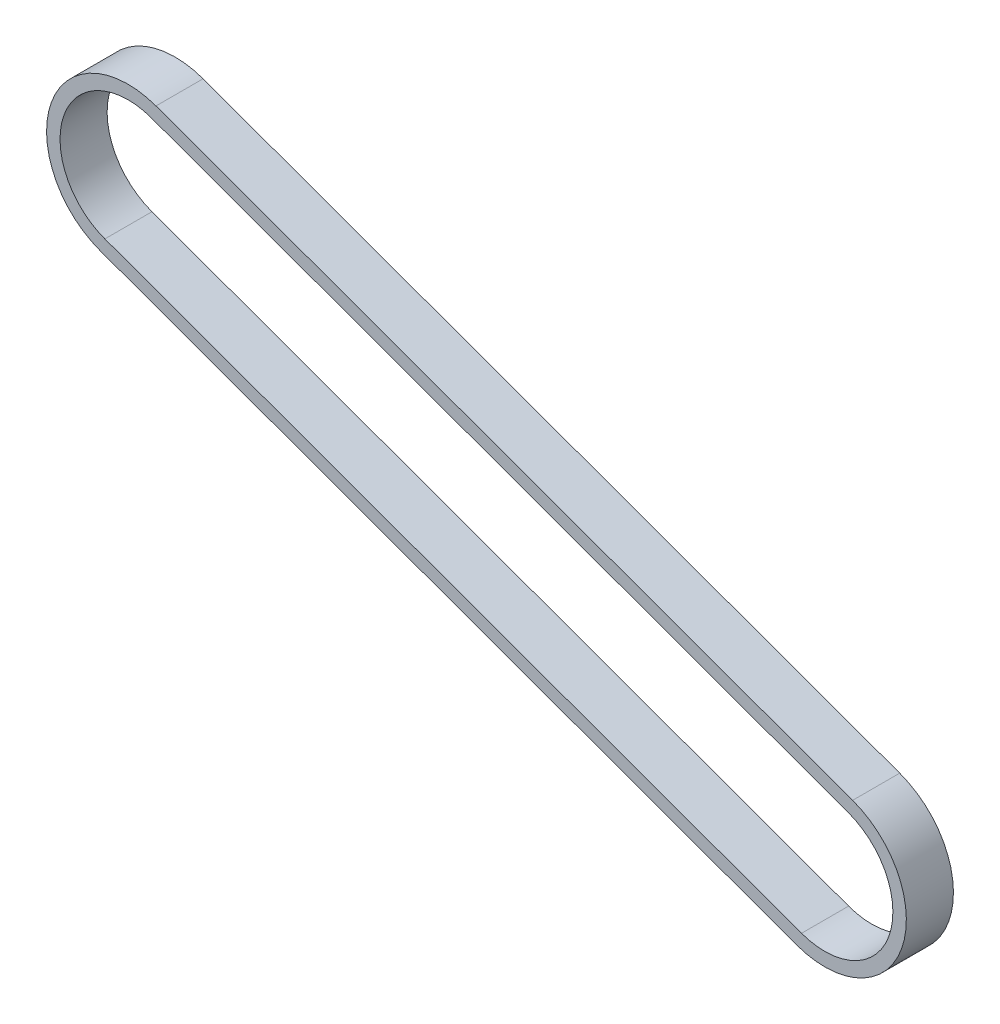
ISO-10303-21;
HEADER;
FILE_DESCRIPTION(('STEP AP214'),'2;1');
FILE_NAME('part.step','',(''),(''),'','','');
FILE_SCHEMA(('AUTOMOTIVE_DESIGN { 1 0 10303 214 1 1 1 1 }'));
ENDSEC;
DATA;
#1=APPLICATION_CONTEXT('core data for automotive mechanical design processes');
#2=APPLICATION_PROTOCOL_DEFINITION('international standard','automotive_design',2000,#1);
#3=PRODUCT_CONTEXT('',#1,'mechanical');
#4=PRODUCT('Part','Part','',(#3));
#5=PRODUCT_RELATED_PRODUCT_CATEGORY('part','',(#4));
#6=PRODUCT_DEFINITION_FORMATION('','',#4);
#7=PRODUCT_DEFINITION_CONTEXT('part definition',#1,'design');
#8=PRODUCT_DEFINITION('design','',#6,#7);
#9=PRODUCT_DEFINITION_SHAPE('','',#8);
#10=(LENGTH_UNIT() NAMED_UNIT(*) SI_UNIT(.MILLI.,.METRE.));
#11=(NAMED_UNIT(*) PLANE_ANGLE_UNIT() SI_UNIT($,.RADIAN.));
#12=(NAMED_UNIT(*) SI_UNIT($,.STERADIAN.) SOLID_ANGLE_UNIT());
#13=UNCERTAINTY_MEASURE_WITH_UNIT(LENGTH_MEASURE(1.E-05),#10,'distance_accuracy_value','');
#14=(GEOMETRIC_REPRESENTATION_CONTEXT(3) GLOBAL_UNCERTAINTY_ASSIGNED_CONTEXT((#13)) GLOBAL_UNIT_ASSIGNED_CONTEXT((#10,
#11,#12)) REPRESENTATION_CONTEXT('',''));
#15=CARTESIAN_POINT('',(0.,0.,0.));
#16=DIRECTION('',(0.,0.,1.));
#17=DIRECTION('',(1.,0.,0.));
#18=AXIS2_PLACEMENT_3D('',#15,#16,#17);
#19=CARTESIAN_POINT('',(-10.2557737110767,3.19883008970123E-12,3.5));
#20=DIRECTION('',(0.,0.,-1.));
#21=DIRECTION('',(-1.,0.,0.));
#22=AXIS2_PLACEMENT_3D('',#19,#20,#21);
#23=PLANE('',#22);
#24=CARTESIAN_POINT('',(-10.2557737110767,3.19883008970123E-12,3.5));
#25=DIRECTION('',(0.,0.,-1.));
#26=DIRECTION('',(-1.,0.,0.));
#27=AXIS2_PLACEMENT_3D('',#24,#25,#26);
#28=CIRCLE('',#27,12.125);
#29=CARTESIAN_POINT('',(-6.11685501181612,11.3967090425694,3.5));
#30=VERTEX_POINT('',#29);
#31=CARTESIAN_POINT('',(-14.3946924103373,-11.396709042563,3.5));
#32=VERTEX_POINT('',#31);
#33=EDGE_CURVE('E160',#30,#32,#28,.F.);
#34=ORIENTED_EDGE('',*,*,#33,.T.);
#35=DIRECTION('',(0.939934766397216,-0.341354119526645,0.));
#36=VECTOR('',#35,1.);
#37=CARTESIAN_POINT('',(-14.3946924103373,-11.396709042563,3.5));
#38=LINE('',#37,#36);
#39=CARTESIAN_POINT('',(89.17841263629,-49.0111343662999,3.5));
#40=VERTEX_POINT('',#39);
#41=EDGE_CURVE('E163',#32,#40,#38,.T.);
#42=ORIENTED_EDGE('',*,*,#41,.T.);
#43=CARTESIAN_POINT('',(93.3173313355506,-37.6144253237337,3.5));
#44=DIRECTION('',(0.,0.,-1.));
#45=DIRECTION('',(-1.,0.,0.));
#46=AXIS2_PLACEMENT_3D('',#43,#44,#45);
#47=CIRCLE('',#46,12.125);
#48=CARTESIAN_POINT('',(97.4562500348111,-26.2177162811674,3.5));
#49=VERTEX_POINT('',#48);
#50=EDGE_CURVE('E166',#40,#49,#47,.F.);
#51=ORIENTED_EDGE('',*,*,#50,.T.);
#52=DIRECTION('',(-0.939934766397216,0.341354119526645,0.));
#53=VECTOR('',#52,1.);
#54=CARTESIAN_POINT('',(-6.11685501181612,11.3967090425694,3.5));
#55=LINE('',#54,#53);
#56=EDGE_CURVE('E168',#49,#30,#55,.T.);
#57=ORIENTED_EDGE('',*,*,#56,.T.);
#58=EDGE_LOOP('',(#34,#42,#51,#57));
#59=FACE_BOUND('',#58,.T.);
#60=CARTESIAN_POINT('',(-10.2557737110767,3.19883008970123E-12,3.5));
#61=DIRECTION('',(0.,0.,1.));
#62=DIRECTION('',(-1.,0.,0.));
#63=AXIS2_PLACEMENT_3D('',#60,#61,#62);
#64=CIRCLE('',#63,10.125);
#65=CARTESIAN_POINT('',(-6.79956325086941,9.51683950977501,3.5));
#66=VERTEX_POINT('',#65);
#67=CARTESIAN_POINT('',(-13.711984171284,-9.51683950976862,3.5));
#68=VERTEX_POINT('',#67);
#69=EDGE_CURVE('E124',#66,#68,#64,.T.);
#70=ORIENTED_EDGE('',*,*,#69,.F.);
#71=DIRECTION('',(-0.939934766397216,0.341354119526645,0.));
#72=VECTOR('',#71,1.);
#73=CARTESIAN_POINT('',(-6.79956325086941,9.51683950977501,3.5));
#74=LINE('',#73,#72);
#75=CARTESIAN_POINT('',(96.7735417957578,-28.0975858139619,3.5));
#76=VERTEX_POINT('',#75);
#77=EDGE_CURVE('E146',#76,#66,#74,.T.);
#78=ORIENTED_EDGE('',*,*,#77,.F.);
#79=CARTESIAN_POINT('',(93.3173313355506,-37.6144253237337,3.5));
#80=DIRECTION('',(0.,0.,1.));
#81=DIRECTION('',(-1.,0.,0.));
#82=AXIS2_PLACEMENT_3D('',#79,#80,#81);
#83=CIRCLE('',#82,10.125);
#84=CARTESIAN_POINT('',(89.8611208753433,-47.1312648335055,3.5));
#85=VERTEX_POINT('',#84);
#86=EDGE_CURVE('E144',#85,#76,#83,.T.);
#87=ORIENTED_EDGE('',*,*,#86,.F.);
#88=DIRECTION('',(0.939934766397216,-0.341354119526645,0.));
#89=VECTOR('',#88,1.);
#90=CARTESIAN_POINT('',(89.8611208753433,-47.1312648335055,3.5));
#91=LINE('',#90,#89);
#92=EDGE_CURVE('E132',#68,#85,#91,.T.);
#93=ORIENTED_EDGE('',*,*,#92,.F.);
#94=EDGE_LOOP('',(#70,#78,#87,#93));
#95=FACE_BOUND('',#94,.T.);
#96=ADVANCED_FACE('F59',(#59,#95),#23,.F.);
#97=CARTESIAN_POINT('',(-10.2557737110767,3.19883008970123E-12,-3.5));
#98=DIRECTION('',(0.,0.,-1.));
#99=DIRECTION('',(-1.,0.,0.));
#100=AXIS2_PLACEMENT_3D('',#97,#98,#99);
#101=PLANE('',#100);
#102=CARTESIAN_POINT('',(-10.2557737110767,3.19883008970123E-12,-3.5));
#103=DIRECTION('',(0.,0.,-1.));
#104=DIRECTION('',(-1.,0.,0.));
#105=AXIS2_PLACEMENT_3D('',#102,#103,#104);
#106=CIRCLE('',#105,12.125);
#107=CARTESIAN_POINT('',(-6.11685501181612,11.3967090425694,-3.5));
#108=VERTEX_POINT('',#107);
#109=CARTESIAN_POINT('',(-14.3946924103373,-11.396709042563,-3.5));
#110=VERTEX_POINT('',#109);
#111=EDGE_CURVE('E140',#108,#110,#106,.F.);
#112=ORIENTED_EDGE('',*,*,#111,.F.);
#113=DIRECTION('',(-0.939934766397216,0.341354119526645,0.));
#114=VECTOR('',#113,1.);
#115=CARTESIAN_POINT('',(-6.11685501181612,11.3967090425694,-3.5));
#116=LINE('',#115,#114);
#117=CARTESIAN_POINT('',(97.4562500348111,-26.2177162811674,-3.5));
#118=VERTEX_POINT('',#117);
#119=EDGE_CURVE('E164',#118,#108,#116,.T.);
#120=ORIENTED_EDGE('',*,*,#119,.F.);
#121=CARTESIAN_POINT('',(93.3173313355506,-37.6144253237337,-3.5));
#122=DIRECTION('',(0.,0.,-1.));
#123=DIRECTION('',(-1.,0.,0.));
#124=AXIS2_PLACEMENT_3D('',#121,#122,#123);
#125=CIRCLE('',#124,12.125);
#126=CARTESIAN_POINT('',(89.17841263629,-49.0111343662999,-3.5));
#127=VERTEX_POINT('',#126);
#128=EDGE_CURVE('E175',#127,#118,#125,.F.);
#129=ORIENTED_EDGE('',*,*,#128,.F.);
#130=DIRECTION('',(0.939934766397216,-0.341354119526645,0.));
#131=VECTOR('',#130,1.);
#132=CARTESIAN_POINT('',(-14.3946924103373,-11.396709042563,-3.5));
#133=LINE('',#132,#131);
#134=EDGE_CURVE('E173',#110,#127,#133,.T.);
#135=ORIENTED_EDGE('',*,*,#134,.F.);
#136=EDGE_LOOP('',(#112,#120,#129,#135));
#137=FACE_BOUND('',#136,.T.);
#138=DIRECTION('',(-0.939934766397216,0.341354119526645,0.));
#139=VECTOR('',#138,1.);
#140=CARTESIAN_POINT('',(-6.79956325086941,9.51683950977501,-3.5));
#141=LINE('',#140,#139);
#142=CARTESIAN_POINT('',(96.7735417957578,-28.0975858139619,-3.5));
#143=VERTEX_POINT('',#142);
#144=CARTESIAN_POINT('',(-6.79956325086941,9.51683950977501,-3.5));
#145=VERTEX_POINT('',#144);
#146=EDGE_CURVE('E133',#143,#145,#141,.T.);
#147=ORIENTED_EDGE('',*,*,#146,.T.);
#148=CARTESIAN_POINT('',(-10.2557737110767,3.19883008970123E-12,-3.5));
#149=DIRECTION('',(0.,0.,1.));
#150=DIRECTION('',(-1.,0.,0.));
#151=AXIS2_PLACEMENT_3D('',#148,#149,#150);
#152=CIRCLE('',#151,10.125);
#153=CARTESIAN_POINT('',(-13.711984171284,-9.51683950976862,-3.5));
#154=VERTEX_POINT('',#153);
#155=EDGE_CURVE('E82',#145,#154,#152,.T.);
#156=ORIENTED_EDGE('',*,*,#155,.T.);
#157=DIRECTION('',(0.939934766397216,-0.341354119526645,0.));
#158=VECTOR('',#157,1.);
#159=CARTESIAN_POINT('',(89.8611208753433,-47.1312648335055,-3.5));
#160=LINE('',#159,#158);
#161=CARTESIAN_POINT('',(89.8611208753433,-47.1312648335055,-3.5));
#162=VERTEX_POINT('',#161);
#163=EDGE_CURVE('E139',#154,#162,#160,.T.);
#164=ORIENTED_EDGE('',*,*,#163,.T.);
#165=CARTESIAN_POINT('',(93.3173313355506,-37.6144253237337,-3.5));
#166=DIRECTION('',(0.,0.,1.));
#167=DIRECTION('',(-1.,0.,0.));
#168=AXIS2_PLACEMENT_3D('',#165,#166,#167);
#169=CIRCLE('',#168,10.125);
#170=EDGE_CURVE('E152',#162,#143,#169,.T.);
#171=ORIENTED_EDGE('',*,*,#170,.T.);
#172=EDGE_LOOP('',(#147,#156,#164,#171));
#173=FACE_BOUND('',#172,.T.);
#174=ADVANCED_FACE('F193',(#137,#173),#101,.T.);
#175=CARTESIAN_POINT('',(-10.2557737110767,3.19883008970123E-12,3.5));
#176=DIRECTION('',(0.,0.,-1.));
#177=DIRECTION('',(-1.,0.,0.));
#178=AXIS2_PLACEMENT_3D('',#175,#176,#177);
#179=CYLINDRICAL_SURFACE('',#178,12.125);
#180=ORIENTED_EDGE('',*,*,#111,.T.);
#181=DIRECTION('',(0.,0.,-1.));
#182=VECTOR('',#181,1.);
#183=CARTESIAN_POINT('',(-14.3946924103373,-11.396709042563,3.5));
#184=LINE('',#183,#182);
#185=EDGE_CURVE('E12',#32,#110,#184,.T.);
#186=ORIENTED_EDGE('',*,*,#185,.F.);
#187=ORIENTED_EDGE('',*,*,#33,.F.);
#188=DIRECTION('',(0.,0.,-1.));
#189=VECTOR('',#188,1.);
#190=CARTESIAN_POINT('',(-6.11685501181612,11.3967090425694,3.5));
#191=LINE('',#190,#189);
#192=EDGE_CURVE('E170',#30,#108,#191,.T.);
#193=ORIENTED_EDGE('',*,*,#192,.T.);
#194=EDGE_LOOP('',(#180,#186,#187,#193));
#195=FACE_BOUND('',#194,.T.);
#196=ADVANCED_FACE('F61',(#195),#179,.T.);
#197=CARTESIAN_POINT('',(-14.3946924103373,-11.396709042563,3.5));
#198=DIRECTION('',(0.341354119526645,0.939934766397216,0.));
#199=DIRECTION('',(-0.939934766397216,0.341354119526645,0.));
#200=AXIS2_PLACEMENT_3D('',#197,#198,#199);
#201=PLANE('',#200);
#202=ORIENTED_EDGE('',*,*,#134,.T.);
#203=DIRECTION('',(0.,0.,-1.));
#204=VECTOR('',#203,1.);
#205=CARTESIAN_POINT('',(89.17841263629,-49.0111343662999,3.5));
#206=LINE('',#205,#204);
#207=EDGE_CURVE('E67',#40,#127,#206,.T.);
#208=ORIENTED_EDGE('',*,*,#207,.F.);
#209=ORIENTED_EDGE('',*,*,#41,.F.);
#210=ORIENTED_EDGE('',*,*,#185,.T.);
#211=EDGE_LOOP('',(#202,#208,#209,#210));
#212=FACE_BOUND('',#211,.T.);
#213=ADVANCED_FACE('F203',(#212),#201,.F.);
#214=CARTESIAN_POINT('',(93.3173313355506,-37.6144253237337,3.5));
#215=DIRECTION('',(0.,0.,-1.));
#216=DIRECTION('',(-1.,0.,0.));
#217=AXIS2_PLACEMENT_3D('',#214,#215,#216);
#218=CYLINDRICAL_SURFACE('',#217,12.125);
#219=ORIENTED_EDGE('',*,*,#128,.T.);
#220=DIRECTION('',(0.,0.,-1.));
#221=VECTOR('',#220,1.);
#222=CARTESIAN_POINT('',(97.4562500348111,-26.2177162811674,3.5));
#223=LINE('',#222,#221);
#224=EDGE_CURVE('E180',#49,#118,#223,.T.);
#225=ORIENTED_EDGE('',*,*,#224,.F.);
#226=ORIENTED_EDGE('',*,*,#50,.F.);
#227=ORIENTED_EDGE('',*,*,#207,.T.);
#228=EDGE_LOOP('',(#219,#225,#226,#227));
#229=FACE_BOUND('',#228,.T.);
#230=ADVANCED_FACE('F187',(#229),#218,.T.);
#231=CARTESIAN_POINT('',(-6.11685501181612,11.3967090425694,3.5));
#232=DIRECTION('',(-0.341354119526645,-0.939934766397216,0.));
#233=DIRECTION('',(0.939934766397216,-0.341354119526645,0.));
#234=AXIS2_PLACEMENT_3D('',#231,#232,#233);
#235=PLANE('',#234);
#236=ORIENTED_EDGE('',*,*,#119,.T.);
#237=ORIENTED_EDGE('',*,*,#192,.F.);
#238=ORIENTED_EDGE('',*,*,#56,.F.);
#239=ORIENTED_EDGE('',*,*,#224,.T.);
#240=EDGE_LOOP('',(#236,#237,#238,#239));
#241=FACE_BOUND('',#240,.T.);
#242=ADVANCED_FACE('F197',(#241),#235,.F.);
#243=CARTESIAN_POINT('',(-10.2557737110767,3.19883008970123E-12,3.5));
#244=DIRECTION('',(0.,0.,-1.));
#245=DIRECTION('',(-1.,0.,0.));
#246=AXIS2_PLACEMENT_3D('',#243,#244,#245);
#247=CYLINDRICAL_SURFACE('',#246,10.125);
#248=ORIENTED_EDGE('',*,*,#155,.F.);
#249=DIRECTION('',(0.,0.,-1.));
#250=VECTOR('',#249,1.);
#251=CARTESIAN_POINT('',(-6.79956325086941,9.51683950977501,3.5));
#252=LINE('',#251,#250);
#253=EDGE_CURVE('E128',#66,#145,#252,.T.);
#254=ORIENTED_EDGE('',*,*,#253,.F.);
#255=ORIENTED_EDGE('',*,*,#69,.T.);
#256=DIRECTION('',(0.,0.,-1.));
#257=VECTOR('',#256,1.);
#258=CARTESIAN_POINT('',(-13.711984171284,-9.51683950976862,3.5));
#259=LINE('',#258,#257);
#260=EDGE_CURVE('E127',#68,#154,#259,.T.);
#261=ORIENTED_EDGE('',*,*,#260,.T.);
#262=EDGE_LOOP('',(#248,#254,#255,#261));
#263=FACE_BOUND('',#262,.T.);
#264=ADVANCED_FACE('F126',(#263),#247,.F.);
#265=CARTESIAN_POINT('',(89.8611208753433,-47.1312648335055,3.5));
#266=DIRECTION('',(0.341354119526645,0.939934766397216,0.));
#267=DIRECTION('',(-0.939934766397216,0.341354119526645,0.));
#268=AXIS2_PLACEMENT_3D('',#265,#266,#267);
#269=PLANE('',#268);
#270=ORIENTED_EDGE('',*,*,#163,.F.);
#271=ORIENTED_EDGE('',*,*,#260,.F.);
#272=ORIENTED_EDGE('',*,*,#92,.T.);
#273=DIRECTION('',(0.,0.,-1.));
#274=VECTOR('',#273,1.);
#275=CARTESIAN_POINT('',(89.8611208753433,-47.1312648335055,3.5));
#276=LINE('',#275,#274);
#277=EDGE_CURVE('E141',#85,#162,#276,.T.);
#278=ORIENTED_EDGE('',*,*,#277,.T.);
#279=EDGE_LOOP('',(#270,#271,#272,#278));
#280=FACE_BOUND('',#279,.T.);
#281=ADVANCED_FACE('F136',(#280),#269,.T.);
#282=CARTESIAN_POINT('',(93.3173313355506,-37.6144253237337,3.5));
#283=DIRECTION('',(0.,0.,-1.));
#284=DIRECTION('',(-1.,0.,0.));
#285=AXIS2_PLACEMENT_3D('',#282,#283,#284);
#286=CYLINDRICAL_SURFACE('',#285,10.125);
#287=ORIENTED_EDGE('',*,*,#170,.F.);
#288=ORIENTED_EDGE('',*,*,#277,.F.);
#289=ORIENTED_EDGE('',*,*,#86,.T.);
#290=DIRECTION('',(0.,0.,-1.));
#291=VECTOR('',#290,1.);
#292=CARTESIAN_POINT('',(96.7735417957578,-28.0975858139619,3.5));
#293=LINE('',#292,#291);
#294=EDGE_CURVE('E74',#76,#143,#293,.T.);
#295=ORIENTED_EDGE('',*,*,#294,.T.);
#296=EDGE_LOOP('',(#287,#288,#289,#295));
#297=FACE_BOUND('',#296,.T.);
#298=ADVANCED_FACE('F226',(#297),#286,.F.);
#299=CARTESIAN_POINT('',(-6.79956325086941,9.51683950977501,3.5));
#300=DIRECTION('',(-0.341354119526645,-0.939934766397216,0.));
#301=DIRECTION('',(0.939934766397216,-0.341354119526645,0.));
#302=AXIS2_PLACEMENT_3D('',#299,#300,#301);
#303=PLANE('',#302);
#304=ORIENTED_EDGE('',*,*,#146,.F.);
#305=ORIENTED_EDGE('',*,*,#294,.F.);
#306=ORIENTED_EDGE('',*,*,#77,.T.);
#307=ORIENTED_EDGE('',*,*,#253,.T.);
#308=EDGE_LOOP('',(#304,#305,#306,#307));
#309=FACE_BOUND('',#308,.T.);
#310=ADVANCED_FACE('F230',(#309),#303,.T.);
#311=CLOSED_SHELL('',(#96,#174,#196,#213,#230,#242,#264,#281,#298,#310));
#312=MANIFOLD_SOLID_BREP('B2',#311);
#313=ADVANCED_BREP_SHAPE_REPRESENTATION('',(#18,#312),#14);
#314=SHAPE_DEFINITION_REPRESENTATION(#9,#313);
ENDSEC;
END-ISO-10303-21;
